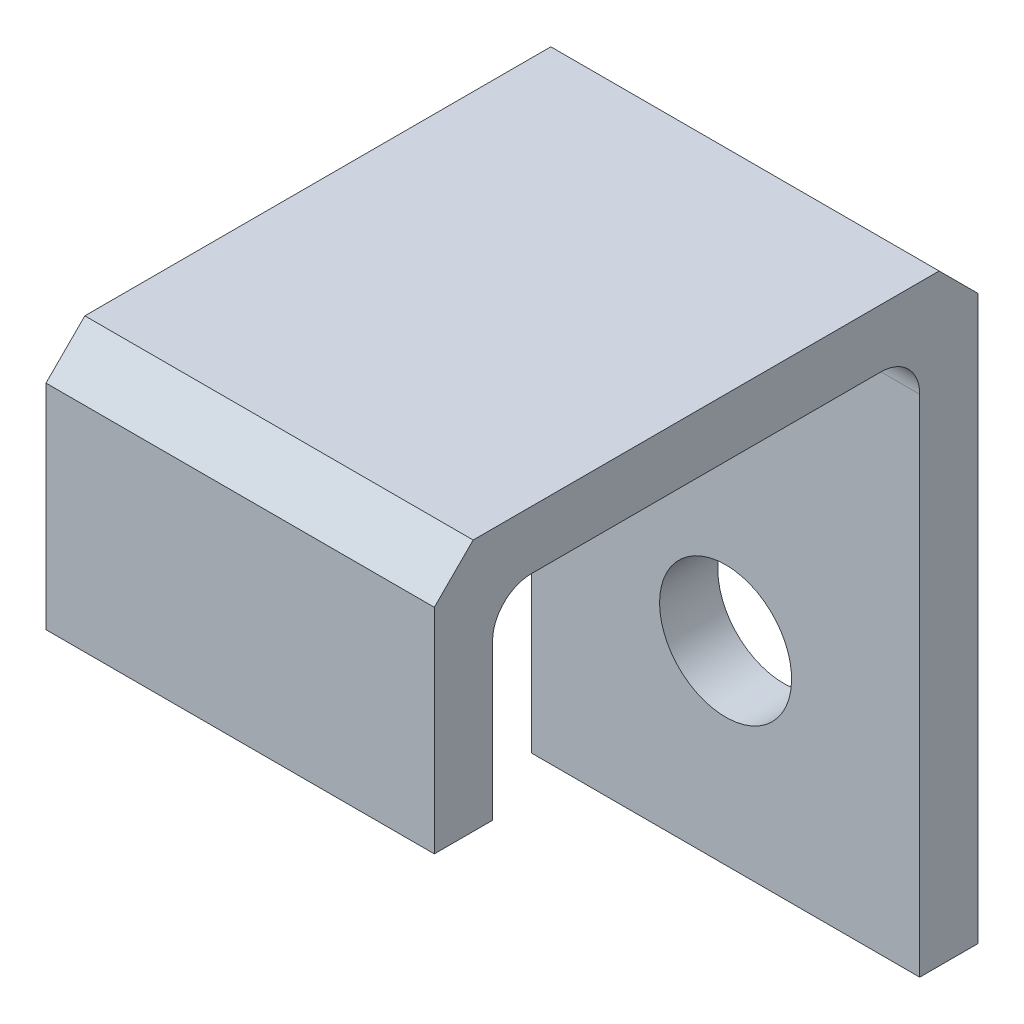
ISO-10303-21;
HEADER;
FILE_DESCRIPTION(('STEP AP214'),'2;1');
FILE_NAME('part.step','',(''),(''),'','','');
FILE_SCHEMA(('AUTOMOTIVE_DESIGN { 1 0 10303 214 1 1 1 1 }'));
ENDSEC;
DATA;
#1=APPLICATION_CONTEXT('core data for automotive mechanical design processes');
#2=APPLICATION_PROTOCOL_DEFINITION('international standard','automotive_design',2000,#1);
#3=PRODUCT_CONTEXT('',#1,'mechanical');
#4=PRODUCT('Part','Part','',(#3));
#5=PRODUCT_RELATED_PRODUCT_CATEGORY('part','',(#4));
#6=PRODUCT_DEFINITION_FORMATION('','',#4);
#7=PRODUCT_DEFINITION_CONTEXT('part definition',#1,'design');
#8=PRODUCT_DEFINITION('design','',#6,#7);
#9=PRODUCT_DEFINITION_SHAPE('','',#8);
#10=(LENGTH_UNIT() NAMED_UNIT(*) SI_UNIT(.MILLI.,.METRE.));
#11=(NAMED_UNIT(*) PLANE_ANGLE_UNIT() SI_UNIT($,.RADIAN.));
#12=(NAMED_UNIT(*) SI_UNIT($,.STERADIAN.) SOLID_ANGLE_UNIT());
#13=UNCERTAINTY_MEASURE_WITH_UNIT(LENGTH_MEASURE(1.E-05),#10,'distance_accuracy_value','');
#14=(GEOMETRIC_REPRESENTATION_CONTEXT(3) GLOBAL_UNCERTAINTY_ASSIGNED_CONTEXT((#13)) GLOBAL_UNIT_ASSIGNED_CONTEXT((#10,
#11,#12)) REPRESENTATION_CONTEXT('',''));
#15=CARTESIAN_POINT('',(0.,0.,0.));
#16=DIRECTION('',(0.,0.,1.));
#17=DIRECTION('',(1.,0.,0.));
#18=AXIS2_PLACEMENT_3D('',#15,#16,#17);
#19=CARTESIAN_POINT('',(10.,6.50000000000008,2.18749999999998));
#20=DIRECTION('',(0.,-0.707106781186547,-0.707106781186548));
#21=DIRECTION('',(0.,0.707106781186548,-0.707106781186547));
#22=AXIS2_PLACEMENT_3D('',#19,#20,#21);
#23=PLANE('',#22);
#24=DIRECTION('',(0.,-0.707106781186548,0.707106781186547));
#25=VECTOR('',#24,1.);
#26=CARTESIAN_POINT('',(0.,6.50000000000008,2.18749999999998));
#27=LINE('',#26,#25);
#28=CARTESIAN_POINT('',(0.,6.50000000000008,2.18749999999998));
#29=VERTEX_POINT('',#28);
#30=CARTESIAN_POINT('',(0.,5.50000000000008,3.18749999999998));
#31=VERTEX_POINT('',#30);
#32=EDGE_CURVE('E157',#29,#31,#27,.T.);
#33=ORIENTED_EDGE('',*,*,#32,.T.);
#34=DIRECTION('',(-1.,0.,0.));
#35=VECTOR('',#34,1.);
#36=CARTESIAN_POINT('',(10.,5.50000000000008,3.18749999999998));
#37=LINE('',#36,#35);
#38=CARTESIAN_POINT('',(10.,5.50000000000008,3.18749999999998));
#39=VERTEX_POINT('',#38);
#40=EDGE_CURVE('E41',#39,#31,#37,.T.);
#41=ORIENTED_EDGE('',*,*,#40,.F.);
#42=DIRECTION('',(0.,-0.707106781186548,0.707106781186547));
#43=VECTOR('',#42,1.);
#44=CARTESIAN_POINT('',(10.,6.50000000000008,2.18749999999998));
#45=LINE('',#44,#43);
#46=CARTESIAN_POINT('',(10.,6.50000000000008,2.18749999999998));
#47=VERTEX_POINT('',#46);
#48=EDGE_CURVE('E105',#47,#39,#45,.T.);
#49=ORIENTED_EDGE('',*,*,#48,.F.);
#50=DIRECTION('',(-1.,0.,0.));
#51=VECTOR('',#50,1.);
#52=CARTESIAN_POINT('',(10.,6.50000000000008,2.18749999999998));
#53=LINE('',#52,#51);
#54=EDGE_CURVE('E11',#47,#29,#53,.T.);
#55=ORIENTED_EDGE('',*,*,#54,.T.);
#56=EDGE_LOOP('',(#33,#41,#49,#55));
#57=FACE_BOUND('',#56,.T.);
#58=ADVANCED_FACE('F33',(#57),#23,.F.);
#59=CARTESIAN_POINT('',(10.,5.29687500000004,3.18749999999998));
#60=DIRECTION('',(0.,0.,-1.));
#61=DIRECTION('',(-1.,0.,0.));
#62=AXIS2_PLACEMENT_3D('',#59,#60,#61);
#63=PLANE('',#62);
#64=DIRECTION('',(0.,-1.,0.));
#65=VECTOR('',#64,1.);
#66=CARTESIAN_POINT('',(0.,5.29687500000004,3.18749999999998));
#67=LINE('',#66,#65);
#68=CARTESIAN_POINT('',(0.,0.,3.18749999999998));
#69=VERTEX_POINT('',#68);
#70=EDGE_CURVE('E160',#31,#69,#67,.T.);
#71=ORIENTED_EDGE('',*,*,#70,.T.);
#72=DIRECTION('',(-1.,0.,0.));
#73=VECTOR('',#72,1.);
#74=CARTESIAN_POINT('',(10.,0.,3.18749999999998));
#75=LINE('',#74,#73);
#76=CARTESIAN_POINT('',(10.,0.,3.18749999999998));
#77=VERTEX_POINT('',#76);
#78=EDGE_CURVE('E198',#77,#69,#75,.T.);
#79=ORIENTED_EDGE('',*,*,#78,.F.);
#80=DIRECTION('',(0.,-1.,0.));
#81=VECTOR('',#80,1.);
#82=CARTESIAN_POINT('',(10.,5.50000000000008,3.18749999999998));
#83=LINE('',#82,#81);
#84=EDGE_CURVE('E205',#39,#77,#83,.T.);
#85=ORIENTED_EDGE('',*,*,#84,.F.);
#86=ORIENTED_EDGE('',*,*,#40,.T.);
#87=EDGE_LOOP('',(#71,#79,#85,#86));
#88=FACE_BOUND('',#87,.T.);
#89=ADVANCED_FACE('F203',(#88),#63,.F.);
#90=CARTESIAN_POINT('',(10.,0.,3.18749999999998));
#91=DIRECTION('',(0.,1.,0.));
#92=DIRECTION('',(0.,0.,1.));
#93=AXIS2_PLACEMENT_3D('',#90,#91,#92);
#94=PLANE('',#93);
#95=DIRECTION('',(0.,0.,-1.));
#96=VECTOR('',#95,1.);
#97=CARTESIAN_POINT('',(0.,0.,3.18749999999998));
#98=LINE('',#97,#96);
#99=CARTESIAN_POINT('',(0.,0.,1.68749999999998));
#100=VERTEX_POINT('',#99);
#101=EDGE_CURVE('E163',#69,#100,#98,.T.);
#102=ORIENTED_EDGE('',*,*,#101,.T.);
#103=DIRECTION('',(-1.,0.,0.));
#104=VECTOR('',#103,1.);
#105=CARTESIAN_POINT('',(10.,0.,1.68749999999998));
#106=LINE('',#105,#104);
#107=CARTESIAN_POINT('',(10.,0.,1.68749999999998));
#108=VERTEX_POINT('',#107);
#109=EDGE_CURVE('E195',#108,#100,#106,.T.);
#110=ORIENTED_EDGE('',*,*,#109,.F.);
#111=DIRECTION('',(0.,0.,-1.));
#112=VECTOR('',#111,1.);
#113=CARTESIAN_POINT('',(10.,0.,3.18749999999998));
#114=LINE('',#113,#112);
#115=EDGE_CURVE('E224',#77,#108,#114,.T.);
#116=ORIENTED_EDGE('',*,*,#115,.F.);
#117=ORIENTED_EDGE('',*,*,#78,.T.);
#118=EDGE_LOOP('',(#102,#110,#116,#117));
#119=FACE_BOUND('',#118,.T.);
#120=ADVANCED_FACE('F215',(#119),#94,.F.);
#121=CARTESIAN_POINT('',(10.,4.00000000000008,1.68749999999998));
#122=DIRECTION('',(0.,0.,1.));
#123=DIRECTION('',(0.,-1.,0.));
#124=AXIS2_PLACEMENT_3D('',#121,#122,#123);
#125=PLANE('',#124);
#126=DIRECTION('',(0.,1.,0.));
#127=VECTOR('',#126,1.);
#128=CARTESIAN_POINT('',(0.,4.00000000000008,1.68749999999998));
#129=LINE('',#128,#127);
#130=CARTESIAN_POINT('',(0.,4.00000000000008,1.68749999999998));
#131=VERTEX_POINT('',#130);
#132=EDGE_CURVE('E165',#100,#131,#129,.T.);
#133=ORIENTED_EDGE('',*,*,#132,.T.);
#134=DIRECTION('',(-1.,0.,0.));
#135=VECTOR('',#134,1.);
#136=CARTESIAN_POINT('',(10.,4.00000000000008,1.68749999999998));
#137=LINE('',#136,#135);
#138=CARTESIAN_POINT('',(10.,4.00000000000008,1.68749999999998));
#139=VERTEX_POINT('',#138);
#140=EDGE_CURVE('E192',#139,#131,#137,.T.);
#141=ORIENTED_EDGE('',*,*,#140,.F.);
#142=DIRECTION('',(0.,1.,0.));
#143=VECTOR('',#142,1.);
#144=CARTESIAN_POINT('',(10.,4.00000000000008,1.68749999999998));
#145=LINE('',#144,#143);
#146=EDGE_CURVE('E221',#108,#139,#145,.T.);
#147=ORIENTED_EDGE('',*,*,#146,.F.);
#148=ORIENTED_EDGE('',*,*,#109,.T.);
#149=EDGE_LOOP('',(#133,#141,#147,#148));
#150=FACE_BOUND('',#149,.T.);
#151=ADVANCED_FACE('F219',(#150),#125,.F.);
#152=CARTESIAN_POINT('',(10.,4.00000000000008,0.687499999999983));
#153=DIRECTION('',(-1.,0.,0.));
#154=DIRECTION('',(0.,0.,1.));
#155=AXIS2_PLACEMENT_3D('',#152,#153,#154);
#156=CYLINDRICAL_SURFACE('',#155,1.);
#157=CARTESIAN_POINT('',(0.,4.00000000000008,0.687499999999983));
#158=DIRECTION('',(-1.,0.,0.));
#159=DIRECTION('',(0.,0.,-1.));
#160=AXIS2_PLACEMENT_3D('',#157,#158,#159);
#161=CIRCLE('',#160,1.);
#162=CARTESIAN_POINT('',(0.,5.00000000000008,0.687499999999976));
#163=VERTEX_POINT('',#162);
#164=EDGE_CURVE('E167',#131,#163,#161,.T.);
#165=ORIENTED_EDGE('',*,*,#164,.T.);
#166=DIRECTION('',(-1.,0.,0.));
#167=VECTOR('',#166,1.);
#168=CARTESIAN_POINT('',(10.,5.00000000000008,0.687499999999976));
#169=LINE('',#168,#167);
#170=CARTESIAN_POINT('',(10.,5.00000000000008,0.687499999999976));
#171=VERTEX_POINT('',#170);
#172=EDGE_CURVE('E189',#171,#163,#169,.T.);
#173=ORIENTED_EDGE('',*,*,#172,.F.);
#174=CARTESIAN_POINT('',(10.,4.00000000000008,0.687499999999983));
#175=DIRECTION('',(-1.,0.,0.));
#176=DIRECTION('',(0.,0.,-1.));
#177=AXIS2_PLACEMENT_3D('',#174,#175,#176);
#178=CIRCLE('',#177,1.);
#179=EDGE_CURVE('E223',#139,#171,#178,.T.);
#180=ORIENTED_EDGE('',*,*,#179,.F.);
#181=ORIENTED_EDGE('',*,*,#140,.T.);
#182=EDGE_LOOP('',(#165,#173,#180,#181));
#183=FACE_BOUND('',#182,.T.);
#184=ADVANCED_FACE('F248',(#183),#156,.F.);
#185=CARTESIAN_POINT('',(10.,5.00000000000009,-8.31250000000001));
#186=DIRECTION('',(0.,1.,0.));
#187=DIRECTION('',(0.,0.,1.));
#188=AXIS2_PLACEMENT_3D('',#185,#186,#187);
#189=PLANE('',#188);
#190=DIRECTION('',(0.,0.,-1.));
#191=VECTOR('',#190,1.);
#192=CARTESIAN_POINT('',(0.,5.00000000000009,-8.31250000000001));
#193=LINE('',#192,#191);
#194=CARTESIAN_POINT('',(0.,5.00000000000008,-8.31250000000001));
#195=VERTEX_POINT('',#194);
#196=EDGE_CURVE('E169',#163,#195,#193,.T.);
#197=ORIENTED_EDGE('',*,*,#196,.T.);
#198=DIRECTION('',(-1.,0.,0.));
#199=VECTOR('',#198,1.);
#200=CARTESIAN_POINT('',(10.,5.00000000000008,-8.31250000000001));
#201=LINE('',#200,#199);
#202=CARTESIAN_POINT('',(10.,5.00000000000008,-8.31250000000001));
#203=VERTEX_POINT('',#202);
#204=EDGE_CURVE('E186',#203,#195,#201,.T.);
#205=ORIENTED_EDGE('',*,*,#204,.F.);
#206=DIRECTION('',(0.,0.,-1.));
#207=VECTOR('',#206,1.);
#208=CARTESIAN_POINT('',(10.,5.00000000000009,-8.31250000000001));
#209=LINE('',#208,#207);
#210=EDGE_CURVE('E226',#171,#203,#209,.T.);
#211=ORIENTED_EDGE('',*,*,#210,.F.);
#212=ORIENTED_EDGE('',*,*,#172,.T.);
#213=EDGE_LOOP('',(#197,#205,#211,#212));
#214=FACE_BOUND('',#213,.T.);
#215=ADVANCED_FACE('F245',(#214),#189,.F.);
#216=CARTESIAN_POINT('',(10.,4.00000000000009,-8.31250000000002));
#217=DIRECTION('',(-1.,0.,0.));
#218=DIRECTION('',(0.,0.,1.));
#219=AXIS2_PLACEMENT_3D('',#216,#217,#218);
#220=CYLINDRICAL_SURFACE('',#219,1.);
#221=CARTESIAN_POINT('',(0.,4.00000000000009,-8.31250000000002));
#222=DIRECTION('',(-1.,0.,0.));
#223=DIRECTION('',(0.,0.,-1.));
#224=AXIS2_PLACEMENT_3D('',#221,#222,#223);
#225=CIRCLE('',#224,1.);
#226=CARTESIAN_POINT('',(0.,4.00000000000008,-9.31250000000002));
#227=VERTEX_POINT('',#226);
#228=EDGE_CURVE('E171',#195,#227,#225,.T.);
#229=ORIENTED_EDGE('',*,*,#228,.T.);
#230=DIRECTION('',(-1.,0.,0.));
#231=VECTOR('',#230,1.);
#232=CARTESIAN_POINT('',(10.,4.00000000000008,-9.31250000000002));
#233=LINE('',#232,#231);
#234=CARTESIAN_POINT('',(10.,4.00000000000008,-9.31250000000002));
#235=VERTEX_POINT('',#234);
#236=EDGE_CURVE('E183',#235,#227,#233,.T.);
#237=ORIENTED_EDGE('',*,*,#236,.F.);
#238=CARTESIAN_POINT('',(10.,4.00000000000009,-8.31250000000002));
#239=DIRECTION('',(-1.,0.,0.));
#240=DIRECTION('',(0.,0.,-1.));
#241=AXIS2_PLACEMENT_3D('',#238,#239,#240);
#242=CIRCLE('',#241,1.);
#243=EDGE_CURVE('E232',#203,#235,#242,.T.);
#244=ORIENTED_EDGE('',*,*,#243,.F.);
#245=ORIENTED_EDGE('',*,*,#204,.T.);
#246=EDGE_LOOP('',(#229,#237,#244,#245));
#247=FACE_BOUND('',#246,.T.);
#248=ADVANCED_FACE('F238',(#247),#220,.F.);
#249=CARTESIAN_POINT('',(10.,4.00000000000008,-9.31250000000002));
#250=DIRECTION('',(0.,0.,-1.));
#251=DIRECTION('',(0.,1.,0.));
#252=AXIS2_PLACEMENT_3D('',#249,#250,#251);
#253=PLANE('',#252);
#254=CARTESIAN_POINT('',(5.,-3.99999999999992,-9.31250000000002));
#255=DIRECTION('',(0.,0.,-1.));
#256=DIRECTION('',(0.,1.,0.));
#257=AXIS2_PLACEMENT_3D('',#254,#255,#256);
#258=CIRCLE('',#257,1.7);
#259=CARTESIAN_POINT('',(5.,-2.29999999999992,-9.31250000000002));
#260=VERTEX_POINT('',#259);
#261=EDGE_CURVE('E161',#260,#260,#258,.T.);
#262=ORIENTED_EDGE('',*,*,#261,.T.);
#263=EDGE_LOOP('',(#262));
#264=FACE_BOUND('',#263,.T.);
#265=DIRECTION('',(0.,-1.,0.));
#266=VECTOR('',#265,1.);
#267=CARTESIAN_POINT('',(0.,4.00000000000008,-9.31250000000002));
#268=LINE('',#267,#266);
#269=CARTESIAN_POINT('',(0.,-8.99999999999991,-9.31250000000002));
#270=VERTEX_POINT('',#269);
#271=EDGE_CURVE('E173',#227,#270,#268,.T.);
#272=ORIENTED_EDGE('',*,*,#271,.T.);
#273=DIRECTION('',(-1.,0.,0.));
#274=VECTOR('',#273,1.);
#275=CARTESIAN_POINT('',(10.,-8.99999999999991,-9.31250000000002));
#276=LINE('',#275,#274);
#277=CARTESIAN_POINT('',(10.,-8.99999999999991,-9.31250000000002));
#278=VERTEX_POINT('',#277);
#279=EDGE_CURVE('E146',#278,#270,#276,.T.);
#280=ORIENTED_EDGE('',*,*,#279,.F.);
#281=DIRECTION('',(0.,-1.,0.));
#282=VECTOR('',#281,1.);
#283=CARTESIAN_POINT('',(10.,4.00000000000008,-9.31250000000002));
#284=LINE('',#283,#282);
#285=EDGE_CURVE('E137',#235,#278,#284,.T.);
#286=ORIENTED_EDGE('',*,*,#285,.F.);
#287=ORIENTED_EDGE('',*,*,#236,.T.);
#288=EDGE_LOOP('',(#272,#280,#286,#287));
#289=FACE_BOUND('',#288,.T.);
#290=ADVANCED_FACE('F242',(#264,#289),#253,.F.);
#291=CARTESIAN_POINT('',(10.,-8.99999999999991,-9.31250000000002));
#292=DIRECTION('',(0.,1.,0.));
#293=DIRECTION('',(0.,0.,1.));
#294=AXIS2_PLACEMENT_3D('',#291,#292,#293);
#295=PLANE('',#294);
#296=DIRECTION('',(0.,0.,-1.));
#297=VECTOR('',#296,1.);
#298=CARTESIAN_POINT('',(0.,-8.99999999999991,-9.31250000000002));
#299=LINE('',#298,#297);
#300=CARTESIAN_POINT('',(0.,-8.99999999999991,-10.8125));
#301=VERTEX_POINT('',#300);
#302=EDGE_CURVE('E145',#270,#301,#299,.T.);
#303=ORIENTED_EDGE('',*,*,#302,.T.);
#304=DIRECTION('',(-1.,0.,0.));
#305=VECTOR('',#304,1.);
#306=CARTESIAN_POINT('',(10.,-8.99999999999991,-10.8125));
#307=LINE('',#306,#305);
#308=CARTESIAN_POINT('',(10.,-8.99999999999991,-10.8125));
#309=VERTEX_POINT('',#308);
#310=EDGE_CURVE('E142',#309,#301,#307,.T.);
#311=ORIENTED_EDGE('',*,*,#310,.F.);
#312=DIRECTION('',(0.,0.,-1.));
#313=VECTOR('',#312,1.);
#314=CARTESIAN_POINT('',(10.,-8.99999999999991,-9.31250000000002));
#315=LINE('',#314,#313);
#316=EDGE_CURVE('E131',#278,#309,#315,.T.);
#317=ORIENTED_EDGE('',*,*,#316,.F.);
#318=ORIENTED_EDGE('',*,*,#279,.T.);
#319=EDGE_LOOP('',(#303,#311,#317,#318));
#320=FACE_BOUND('',#319,.T.);
#321=ADVANCED_FACE('F143',(#320),#295,.F.);
#322=CARTESIAN_POINT('',(10.,5.50000000000008,-10.8125));
#323=DIRECTION('',(0.,0.,1.));
#324=DIRECTION('',(1.,0.,0.));
#325=AXIS2_PLACEMENT_3D('',#322,#323,#324);
#326=PLANE('',#325);
#327=CARTESIAN_POINT('',(5.,-3.99999999999992,-10.8125));
#328=DIRECTION('',(0.,0.,-1.));
#329=DIRECTION('',(-1.,0.,0.));
#330=AXIS2_PLACEMENT_3D('',#327,#328,#329);
#331=CIRCLE('',#330,1.7);
#332=CARTESIAN_POINT('',(3.3,-3.99999999999992,-10.8125));
#333=VERTEX_POINT('',#332);
#334=EDGE_CURVE('E367',#333,#333,#331,.T.);
#335=ORIENTED_EDGE('',*,*,#334,.F.);
#336=EDGE_LOOP('',(#335));
#337=FACE_BOUND('',#336,.T.);
#338=DIRECTION('',(0.,1.,0.));
#339=VECTOR('',#338,1.);
#340=CARTESIAN_POINT('',(0.,5.50000000000008,-10.8125));
#341=LINE('',#340,#339);
#342=CARTESIAN_POINT('',(0.,5.50000000000008,-10.8125));
#343=VERTEX_POINT('',#342);
#344=EDGE_CURVE('E91',#301,#343,#341,.T.);
#345=ORIENTED_EDGE('',*,*,#344,.T.);
#346=DIRECTION('',(-1.,0.,0.));
#347=VECTOR('',#346,1.);
#348=CARTESIAN_POINT('',(10.,5.50000000000008,-10.8125));
#349=LINE('',#348,#347);
#350=CARTESIAN_POINT('',(10.,5.50000000000008,-10.8125));
#351=VERTEX_POINT('',#350);
#352=EDGE_CURVE('E147',#351,#343,#349,.T.);
#353=ORIENTED_EDGE('',*,*,#352,.F.);
#354=DIRECTION('',(0.,1.,0.));
#355=VECTOR('',#354,1.);
#356=CARTESIAN_POINT('',(10.,5.50000000000008,-10.8125));
#357=LINE('',#356,#355);
#358=EDGE_CURVE('E135',#309,#351,#357,.T.);
#359=ORIENTED_EDGE('',*,*,#358,.F.);
#360=ORIENTED_EDGE('',*,*,#310,.T.);
#361=EDGE_LOOP('',(#345,#353,#359,#360));
#362=FACE_BOUND('',#361,.T.);
#363=ADVANCED_FACE('F149',(#337,#362),#326,.F.);
#364=CARTESIAN_POINT('',(10.,6.50000000000008,-9.81250000000002));
#365=DIRECTION('',(0.,-0.707106781186547,0.707106781186548));
#366=DIRECTION('',(0.,-0.707106781186548,-0.707106781186547));
#367=AXIS2_PLACEMENT_3D('',#364,#365,#366);
#368=PLANE('',#367);
#369=DIRECTION('',(0.,0.707106781186548,0.707106781186547));
#370=VECTOR('',#369,1.);
#371=CARTESIAN_POINT('',(0.,6.50000000000008,-9.81250000000002));
#372=LINE('',#371,#370);
#373=CARTESIAN_POINT('',(0.,6.50000000000008,-9.81250000000002));
#374=VERTEX_POINT('',#373);
#375=EDGE_CURVE('E98',#343,#374,#372,.T.);
#376=ORIENTED_EDGE('',*,*,#375,.T.);
#377=DIRECTION('',(-1.,0.,0.));
#378=VECTOR('',#377,1.);
#379=CARTESIAN_POINT('',(10.,6.50000000000008,-9.81250000000002));
#380=LINE('',#379,#378);
#381=CARTESIAN_POINT('',(10.,6.50000000000008,-9.81250000000002));
#382=VERTEX_POINT('',#381);
#383=EDGE_CURVE('E153',#382,#374,#380,.T.);
#384=ORIENTED_EDGE('',*,*,#383,.F.);
#385=DIRECTION('',(0.,0.707106781186548,0.707106781186547));
#386=VECTOR('',#385,1.);
#387=CARTESIAN_POINT('',(10.,6.50000000000008,-9.81250000000002));
#388=LINE('',#387,#386);
#389=EDGE_CURVE('E151',#351,#382,#388,.T.);
#390=ORIENTED_EDGE('',*,*,#389,.F.);
#391=ORIENTED_EDGE('',*,*,#352,.T.);
#392=EDGE_LOOP('',(#376,#384,#390,#391));
#393=FACE_BOUND('',#392,.T.);
#394=ADVANCED_FACE('F306',(#393),#368,.F.);
#395=CARTESIAN_POINT('',(10.,6.50000000000008,-4.87499999999996));
#396=DIRECTION('',(0.,-1.,0.));
#397=DIRECTION('',(0.,0.,-1.));
#398=AXIS2_PLACEMENT_3D('',#395,#396,#397);
#399=PLANE('',#398);
#400=DIRECTION('',(0.,0.,1.));
#401=VECTOR('',#400,1.);
#402=CARTESIAN_POINT('',(0.,6.50000000000008,-4.87499999999996));
#403=LINE('',#402,#401);
#404=EDGE_CURVE('E178',#374,#29,#403,.T.);
#405=ORIENTED_EDGE('',*,*,#404,.T.);
#406=ORIENTED_EDGE('',*,*,#54,.F.);
#407=DIRECTION('',(0.,0.,1.));
#408=VECTOR('',#407,1.);
#409=CARTESIAN_POINT('',(10.,6.50000000000008,-4.87499999999996));
#410=LINE('',#409,#408);
#411=EDGE_CURVE('E49',#382,#47,#410,.T.);
#412=ORIENTED_EDGE('',*,*,#411,.F.);
#413=ORIENTED_EDGE('',*,*,#383,.T.);
#414=EDGE_LOOP('',(#405,#406,#412,#413));
#415=FACE_BOUND('',#414,.T.);
#416=ADVANCED_FACE('F311',(#415),#399,.F.);
#417=CARTESIAN_POINT('',(10.,4.00000000000008,0.687499999999983));
#418=DIRECTION('',(1.,0.,0.));
#419=DIRECTION('',(0.,0.,-1.));
#420=AXIS2_PLACEMENT_3D('',#417,#418,#419);
#421=PLANE('',#420);
#422=ORIENTED_EDGE('',*,*,#411,.T.);
#423=ORIENTED_EDGE('',*,*,#48,.T.);
#424=ORIENTED_EDGE('',*,*,#84,.T.);
#425=ORIENTED_EDGE('',*,*,#115,.T.);
#426=ORIENTED_EDGE('',*,*,#146,.T.);
#427=ORIENTED_EDGE('',*,*,#179,.T.);
#428=ORIENTED_EDGE('',*,*,#210,.T.);
#429=ORIENTED_EDGE('',*,*,#243,.T.);
#430=ORIENTED_EDGE('',*,*,#285,.T.);
#431=ORIENTED_EDGE('',*,*,#316,.T.);
#432=ORIENTED_EDGE('',*,*,#358,.T.);
#433=ORIENTED_EDGE('',*,*,#389,.T.);
#434=EDGE_LOOP('',(#422,#423,#424,#425,#426,#427,#428,#429,#430,#431,#432,#433));
#435=FACE_BOUND('',#434,.T.);
#436=ADVANCED_FACE('F133',(#435),#421,.T.);
#437=CARTESIAN_POINT('',(0.,4.00000000000008,0.687499999999983));
#438=DIRECTION('',(1.,0.,0.));
#439=DIRECTION('',(0.,0.,-1.));
#440=AXIS2_PLACEMENT_3D('',#437,#438,#439);
#441=PLANE('',#440);
#442=ORIENTED_EDGE('',*,*,#32,.F.);
#443=ORIENTED_EDGE('',*,*,#404,.F.);
#444=ORIENTED_EDGE('',*,*,#375,.F.);
#445=ORIENTED_EDGE('',*,*,#344,.F.);
#446=ORIENTED_EDGE('',*,*,#302,.F.);
#447=ORIENTED_EDGE('',*,*,#271,.F.);
#448=ORIENTED_EDGE('',*,*,#228,.F.);
#449=ORIENTED_EDGE('',*,*,#196,.F.);
#450=ORIENTED_EDGE('',*,*,#164,.F.);
#451=ORIENTED_EDGE('',*,*,#132,.F.);
#452=ORIENTED_EDGE('',*,*,#101,.F.);
#453=ORIENTED_EDGE('',*,*,#70,.F.);
#454=EDGE_LOOP('',(#442,#443,#444,#445,#446,#447,#448,#449,#450,#451,#452,#453));
#455=FACE_BOUND('',#454,.T.);
#456=ADVANCED_FACE('F209',(#455),#441,.F.);
#457=CARTESIAN_POINT('',(5.,-3.99999999999992,-0.812500000000018));
#458=DIRECTION('',(0.,0.,-1.));
#459=DIRECTION('',(-1.,0.,0.));
#460=AXIS2_PLACEMENT_3D('',#457,#458,#459);
#461=CYLINDRICAL_SURFACE('',#460,1.7);
#462=ORIENTED_EDGE('',*,*,#334,.T.);
#463=EDGE_LOOP('',(#462));
#464=FACE_BOUND('',#463,.T.);
#465=ORIENTED_EDGE('',*,*,#261,.F.);
#466=EDGE_LOOP('',(#465));
#467=FACE_BOUND('',#466,.T.);
#468=ADVANCED_FACE('F337',(#464,#467),#461,.F.);
#469=CLOSED_SHELL('',(#58,#89,#120,#151,#184,#215,#248,#290,#321,#363,#394,#416,#436,#456,#468));
#470=MANIFOLD_SOLID_BREP('B2',#469);
#471=ADVANCED_BREP_SHAPE_REPRESENTATION('',(#18,#470),#14);
#472=SHAPE_DEFINITION_REPRESENTATION(#9,#471);
ENDSEC;
END-ISO-10303-21;
